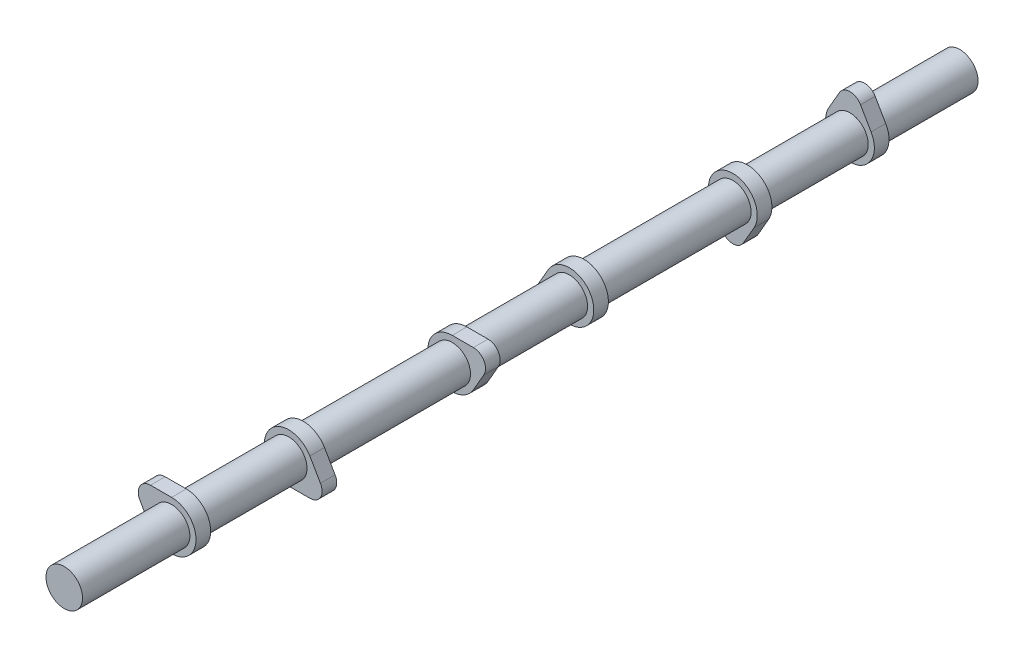
ISO-10303-21;
HEADER;
FILE_DESCRIPTION(('STEP AP214'),'2;1');
FILE_NAME('part.step','',(''),(''),'','','');
FILE_SCHEMA(('AUTOMOTIVE_DESIGN { 1 0 10303 214 1 1 1 1 }'));
ENDSEC;
DATA;
#1=APPLICATION_CONTEXT('core data for automotive mechanical design processes');
#2=APPLICATION_PROTOCOL_DEFINITION('international standard','automotive_design',2000,#1);
#3=PRODUCT_CONTEXT('',#1,'mechanical');
#4=PRODUCT('Part','Part','',(#3));
#5=PRODUCT_RELATED_PRODUCT_CATEGORY('part','',(#4));
#6=PRODUCT_DEFINITION_FORMATION('','',#4);
#7=PRODUCT_DEFINITION_CONTEXT('part definition',#1,'design');
#8=PRODUCT_DEFINITION('design','',#6,#7);
#9=PRODUCT_DEFINITION_SHAPE('','',#8);
#10=(LENGTH_UNIT() NAMED_UNIT(*) SI_UNIT(.MILLI.,.METRE.));
#11=(NAMED_UNIT(*) PLANE_ANGLE_UNIT() SI_UNIT($,.RADIAN.));
#12=(NAMED_UNIT(*) SI_UNIT($,.STERADIAN.) SOLID_ANGLE_UNIT());
#13=UNCERTAINTY_MEASURE_WITH_UNIT(LENGTH_MEASURE(1.E-05),#10,'distance_accuracy_value','');
#14=(GEOMETRIC_REPRESENTATION_CONTEXT(3) GLOBAL_UNCERTAINTY_ASSIGNED_CONTEXT((#13)) GLOBAL_UNIT_ASSIGNED_CONTEXT((#10,
#11,#12)) REPRESENTATION_CONTEXT('',''));
#15=CARTESIAN_POINT('',(0.,0.,0.));
#16=DIRECTION('',(0.,0.,1.));
#17=DIRECTION('',(1.,0.,0.));
#18=AXIS2_PLACEMENT_3D('',#15,#16,#17);
#19=CARTESIAN_POINT('',(0.,0.,412.75));
#20=DIRECTION('',(0.,0.,-1.));
#21=DIRECTION('',(-1.,0.,0.));
#22=AXIS2_PLACEMENT_3D('',#19,#20,#21);
#23=CYLINDRICAL_SURFACE('',#22,9.5);
#24=CARTESIAN_POINT('',(0.,0.,210.82));
#25=DIRECTION('',(0.,0.,1.));
#26=DIRECTION('',(1.,0.,0.));
#27=AXIS2_PLACEMENT_3D('',#24,#25,#26);
#28=CIRCLE('',#27,9.5);
#29=CARTESIAN_POINT('',(9.5,0.,210.82));
#30=VERTEX_POINT('',#29);
#31=EDGE_CURVE('E399',#30,#30,#28,.F.);
#32=ORIENTED_EDGE('',*,*,#31,.F.);
#33=EDGE_LOOP('',(#32));
#34=FACE_BOUND('',#33,.T.);
#35=CARTESIAN_POINT('',(0.,0.,288.29));
#36=DIRECTION('',(0.,0.,1.));
#37=DIRECTION('',(1.,0.,0.));
#38=AXIS2_PLACEMENT_3D('',#35,#36,#37);
#39=CIRCLE('',#38,9.5);
#40=CARTESIAN_POINT('',(9.5,0.,288.29));
#41=VERTEX_POINT('',#40);
#42=EDGE_CURVE('E230',#41,#41,#39,.F.);
#43=ORIENTED_EDGE('',*,*,#42,.T.);
#44=EDGE_LOOP('',(#43));
#45=FACE_BOUND('',#44,.T.);
#46=ADVANCED_FACE('F33',(#34,#45),#23,.T.);
#47=CARTESIAN_POINT('',(0.,0.,64.77));
#48=DIRECTION('',(0.,0.,1.));
#49=DIRECTION('',(1.,0.,0.));
#50=AXIS2_PLACEMENT_3D('',#47,#48,#49);
#51=CIRCLE('',#50,9.5);
#52=CARTESIAN_POINT('',(9.5,0.,64.77));
#53=VERTEX_POINT('',#52);
#54=EDGE_CURVE('E371',#53,#53,#51,.F.);
#55=ORIENTED_EDGE('',*,*,#54,.F.);
#56=EDGE_LOOP('',(#55));
#57=FACE_BOUND('',#56,.T.);
#58=CARTESIAN_POINT('',(0.,0.,142.24));
#59=DIRECTION('',(0.,0.,1.));
#60=DIRECTION('',(1.,0.,0.));
#61=AXIS2_PLACEMENT_3D('',#58,#59,#60);
#62=CIRCLE('',#61,9.5);
#63=CARTESIAN_POINT('',(9.5,0.,142.24));
#64=VERTEX_POINT('',#63);
#65=EDGE_CURVE('E298',#64,#64,#62,.F.);
#66=ORIENTED_EDGE('',*,*,#65,.T.);
#67=EDGE_LOOP('',(#66));
#68=FACE_BOUND('',#67,.T.);
#69=ADVANCED_FACE('F436',(#57,#68),#23,.T.);
#70=CARTESIAN_POINT('',(0.,0.,3.80999999999998));
#71=DIRECTION('',(0.,0.,1.));
#72=DIRECTION('',(1.,0.,0.));
#73=AXIS2_PLACEMENT_3D('',#70,#71,#72);
#74=CIRCLE('',#73,9.5);
#75=CARTESIAN_POINT('',(9.5,0.,3.80999999999998));
#76=VERTEX_POINT('',#75);
#77=EDGE_CURVE('E368',#76,#76,#74,.T.);
#78=ORIENTED_EDGE('',*,*,#77,.T.);
#79=EDGE_LOOP('',(#78));
#80=FACE_BOUND('',#79,.T.);
#81=CARTESIAN_POINT('',(0.,0.,57.15));
#82=DIRECTION('',(0.,0.,1.));
#83=DIRECTION('',(1.,0.,0.));
#84=AXIS2_PLACEMENT_3D('',#81,#82,#83);
#85=CIRCLE('',#84,9.5);
#86=CARTESIAN_POINT('',(9.5,0.,57.15));
#87=VERTEX_POINT('',#86);
#88=EDGE_CURVE('E360',#87,#87,#85,.F.);
#89=ORIENTED_EDGE('',*,*,#88,.T.);
#90=EDGE_LOOP('',(#89));
#91=FACE_BOUND('',#90,.T.);
#92=ADVANCED_FACE('F442',(#80,#91),#23,.T.);
#93=CARTESIAN_POINT('',(0.,12.7,3.81));
#94=DIRECTION('',(0.,0.,-1.));
#95=DIRECTION('',(-1.,0.,0.));
#96=AXIS2_PLACEMENT_3D('',#93,#94,#95);
#97=CYLINDRICAL_SURFACE('',#96,6.35);
#98=CARTESIAN_POINT('',(0.,12.7,-3.81));
#99=DIRECTION('',(0.,0.,1.));
#100=DIRECTION('',(1.,0.,0.));
#101=AXIS2_PLACEMENT_3D('',#98,#99,#100);
#102=CIRCLE('',#101,6.35);
#103=CARTESIAN_POINT('',(5.49926131403119,15.875,-3.81));
#104=VERTEX_POINT('',#103);
#105=CARTESIAN_POINT('',(-5.49926131403118,15.875,-3.81));
#106=VERTEX_POINT('',#105);
#107=EDGE_CURVE('E380',#104,#106,#102,.T.);
#108=ORIENTED_EDGE('',*,*,#107,.T.);
#109=DIRECTION('',(0.,0.,-1.));
#110=VECTOR('',#109,1.);
#111=CARTESIAN_POINT('',(-5.49926131403118,15.875,3.81));
#112=LINE('',#111,#110);
#113=CARTESIAN_POINT('',(-5.49926131403118,15.875,3.81));
#114=VERTEX_POINT('',#113);
#115=EDGE_CURVE('E372',#114,#106,#112,.T.);
#116=ORIENTED_EDGE('',*,*,#115,.F.);
#117=CARTESIAN_POINT('',(0.,12.7,3.81));
#118=DIRECTION('',(0.,0.,1.));
#119=DIRECTION('',(1.,0.,0.));
#120=AXIS2_PLACEMENT_3D('',#117,#118,#119);
#121=CIRCLE('',#120,6.35);
#122=CARTESIAN_POINT('',(5.49926131403119,15.875,3.81));
#123=VERTEX_POINT('',#122);
#124=EDGE_CURVE('E373',#123,#114,#121,.T.);
#125=ORIENTED_EDGE('',*,*,#124,.F.);
#126=DIRECTION('',(0.,0.,-1.));
#127=VECTOR('',#126,1.);
#128=CARTESIAN_POINT('',(5.49926131403119,15.875,3.81));
#129=LINE('',#128,#127);
#130=EDGE_CURVE('E379',#123,#104,#129,.T.);
#131=ORIENTED_EDGE('',*,*,#130,.T.);
#132=EDGE_LOOP('',(#108,#116,#125,#131));
#133=FACE_BOUND('',#132,.T.);
#134=ADVANCED_FACE('F35',(#133),#97,.T.);
#135=CARTESIAN_POINT('',(-5.49926131403118,15.875,3.81));
#136=DIRECTION('',(0.866025403784439,-0.5,0.));
#137=DIRECTION('',(0.5,0.866025403784439,0.));
#138=AXIS2_PLACEMENT_3D('',#135,#136,#137);
#139=PLANE('',#138);
#140=DIRECTION('',(-0.5,-0.866025403784439,0.));
#141=VECTOR('',#140,1.);
#142=CARTESIAN_POINT('',(-5.49926131403118,15.875,-3.81));
#143=LINE('',#142,#141);
#144=CARTESIAN_POINT('',(-10.9985226280624,6.35,-3.81));
#145=VERTEX_POINT('',#144);
#146=EDGE_CURVE('E383',#106,#145,#143,.T.);
#147=ORIENTED_EDGE('',*,*,#146,.T.);
#148=DIRECTION('',(0.,0.,-1.));
#149=VECTOR('',#148,1.);
#150=CARTESIAN_POINT('',(-10.9985226280624,6.35,3.81));
#151=LINE('',#150,#149);
#152=CARTESIAN_POINT('',(-10.9985226280624,6.35,3.81));
#153=VERTEX_POINT('',#152);
#154=EDGE_CURVE('E390',#153,#145,#151,.T.);
#155=ORIENTED_EDGE('',*,*,#154,.F.);
#156=DIRECTION('',(-0.5,-0.866025403784439,0.));
#157=VECTOR('',#156,1.);
#158=CARTESIAN_POINT('',(-5.49926131403118,15.875,3.81));
#159=LINE('',#158,#157);
#160=EDGE_CURVE('E82',#114,#153,#159,.T.);
#161=ORIENTED_EDGE('',*,*,#160,.F.);
#162=ORIENTED_EDGE('',*,*,#115,.T.);
#163=EDGE_LOOP('',(#147,#155,#161,#162));
#164=FACE_BOUND('',#163,.T.);
#165=ADVANCED_FACE('F592',(#164),#139,.F.);
#166=CARTESIAN_POINT('',(0.,0.,3.81));
#167=DIRECTION('',(0.,0.,-1.));
#168=DIRECTION('',(-1.,0.,0.));
#169=AXIS2_PLACEMENT_3D('',#166,#167,#168);
#170=CYLINDRICAL_SURFACE('',#169,12.7);
#171=CARTESIAN_POINT('',(0.,0.,-3.81));
#172=DIRECTION('',(0.,0.,1.));
#173=DIRECTION('',(1.,0.,0.));
#174=AXIS2_PLACEMENT_3D('',#171,#172,#173);
#175=CIRCLE('',#174,12.7);
#176=CARTESIAN_POINT('',(10.9985226280624,6.35,-3.81));
#177=VERTEX_POINT('',#176);
#178=EDGE_CURVE('E68',#145,#177,#175,.T.);
#179=ORIENTED_EDGE('',*,*,#178,.T.);
#180=DIRECTION('',(0.,0.,-1.));
#181=VECTOR('',#180,1.);
#182=CARTESIAN_POINT('',(10.9985226280624,6.35,3.81));
#183=LINE('',#182,#181);
#184=CARTESIAN_POINT('',(10.9985226280624,6.35,3.81));
#185=VERTEX_POINT('',#184);
#186=EDGE_CURVE('E388',#185,#177,#183,.T.);
#187=ORIENTED_EDGE('',*,*,#186,.F.);
#188=CARTESIAN_POINT('',(0.,0.,3.81));
#189=DIRECTION('',(0.,0.,1.));
#190=DIRECTION('',(1.,0.,0.));
#191=AXIS2_PLACEMENT_3D('',#188,#189,#190);
#192=CIRCLE('',#191,12.7);
#193=EDGE_CURVE('E376',#153,#185,#192,.T.);
#194=ORIENTED_EDGE('',*,*,#193,.F.);
#195=ORIENTED_EDGE('',*,*,#154,.T.);
#196=EDGE_LOOP('',(#179,#187,#194,#195));
#197=FACE_BOUND('',#196,.T.);
#198=ADVANCED_FACE('F881',(#197),#170,.T.);
#199=CARTESIAN_POINT('',(5.49926131403119,15.875,3.81));
#200=DIRECTION('',(-0.866025403784439,-0.5,0.));
#201=DIRECTION('',(0.5,-0.866025403784439,0.));
#202=AXIS2_PLACEMENT_3D('',#199,#200,#201);
#203=PLANE('',#202);
#204=DIRECTION('',(-0.5,0.866025403784439,0.));
#205=VECTOR('',#204,1.);
#206=CARTESIAN_POINT('',(5.49926131403119,15.875,-3.81));
#207=LINE('',#206,#205);
#208=EDGE_CURVE('E74',#177,#104,#207,.T.);
#209=ORIENTED_EDGE('',*,*,#208,.T.);
#210=ORIENTED_EDGE('',*,*,#130,.F.);
#211=DIRECTION('',(-0.5,0.866025403784439,0.));
#212=VECTOR('',#211,1.);
#213=CARTESIAN_POINT('',(5.49926131403119,15.875,3.81));
#214=LINE('',#213,#212);
#215=EDGE_CURVE('E50',#185,#123,#214,.T.);
#216=ORIENTED_EDGE('',*,*,#215,.F.);
#217=ORIENTED_EDGE('',*,*,#186,.T.);
#218=EDGE_LOOP('',(#209,#210,#216,#217));
#219=FACE_BOUND('',#218,.T.);
#220=ADVANCED_FACE('F859',(#219),#203,.F.);
#221=CARTESIAN_POINT('',(0.,12.7,3.81));
#222=DIRECTION('',(0.,0.,1.));
#223=DIRECTION('',(1.,0.,0.));
#224=AXIS2_PLACEMENT_3D('',#221,#222,#223);
#225=PLANE('',#224);
#226=ORIENTED_EDGE('',*,*,#77,.F.);
#227=EDGE_LOOP('',(#226));
#228=FACE_BOUND('',#227,.T.);
#229=ORIENTED_EDGE('',*,*,#124,.T.);
#230=ORIENTED_EDGE('',*,*,#160,.T.);
#231=ORIENTED_EDGE('',*,*,#193,.T.);
#232=ORIENTED_EDGE('',*,*,#215,.T.);
#233=EDGE_LOOP('',(#229,#230,#231,#232));
#234=FACE_BOUND('',#233,.T.);
#235=ADVANCED_FACE('F850',(#228,#234),#225,.T.);
#236=CARTESIAN_POINT('',(0.,12.7,-3.81));
#237=DIRECTION('',(0.,0.,1.));
#238=DIRECTION('',(1.,0.,0.));
#239=AXIS2_PLACEMENT_3D('',#236,#237,#238);
#240=PLANE('',#239);
#241=CARTESIAN_POINT('',(0.,0.,-3.80999999999998));
#242=DIRECTION('',(0.,0.,1.));
#243=DIRECTION('',(1.,0.,0.));
#244=AXIS2_PLACEMENT_3D('',#241,#242,#243);
#245=CIRCLE('',#244,9.5);
#246=CARTESIAN_POINT('',(9.5,0.,-3.80999999999998));
#247=VERTEX_POINT('',#246);
#248=EDGE_CURVE('E364',#247,#247,#245,.T.);
#249=ORIENTED_EDGE('',*,*,#248,.T.);
#250=EDGE_LOOP('',(#249));
#251=FACE_BOUND('',#250,.T.);
#252=ORIENTED_EDGE('',*,*,#107,.F.);
#253=ORIENTED_EDGE('',*,*,#208,.F.);
#254=ORIENTED_EDGE('',*,*,#178,.F.);
#255=ORIENTED_EDGE('',*,*,#146,.F.);
#256=EDGE_LOOP('',(#252,#253,#254,#255));
#257=FACE_BOUND('',#256,.T.);
#258=ADVANCED_FACE('F583',(#251,#257),#240,.F.);
#259=CARTESIAN_POINT('',(0.,0.,-53.34));
#260=DIRECTION('',(0.,0.,-1.));
#261=DIRECTION('',(-1.,0.,0.));
#262=AXIS2_PLACEMENT_3D('',#259,#260,#261);
#263=PLANE('',#262);
#264=CARTESIAN_POINT('',(0.,0.,-53.34));
#265=DIRECTION('',(0.,0.,-1.));
#266=DIRECTION('',(-1.,0.,0.));
#267=AXIS2_PLACEMENT_3D('',#264,#265,#266);
#268=CIRCLE('',#267,9.5);
#269=CARTESIAN_POINT('',(-9.5,0.,-53.34));
#270=VERTEX_POINT('',#269);
#271=EDGE_CURVE('E365',#270,#270,#268,.T.);
#272=ORIENTED_EDGE('',*,*,#271,.T.);
#273=EDGE_LOOP('',(#272));
#274=FACE_BOUND('',#273,.T.);
#275=ADVANCED_FACE('F566',(#274),#263,.T.);
#276=ORIENTED_EDGE('',*,*,#271,.F.);
#277=EDGE_LOOP('',(#276));
#278=FACE_BOUND('',#277,.T.);
#279=ORIENTED_EDGE('',*,*,#248,.F.);
#280=EDGE_LOOP('',(#279));
#281=FACE_BOUND('',#280,.T.);
#282=ADVANCED_FACE('F422',(#278,#281),#23,.T.);
#283=CARTESIAN_POINT('',(0.,-12.7,64.77));
#284=DIRECTION('',(0.,0.,-1.));
#285=DIRECTION('',(1.,0.,0.));
#286=AXIS2_PLACEMENT_3D('',#283,#284,#285);
#287=CYLINDRICAL_SURFACE('',#286,6.35);
#288=CARTESIAN_POINT('',(0.,-12.7,57.15));
#289=DIRECTION('',(0.,0.,1.));
#290=DIRECTION('',(-1.,0.,0.));
#291=AXIS2_PLACEMENT_3D('',#288,#289,#290);
#292=CIRCLE('',#291,6.35);
#293=CARTESIAN_POINT('',(-5.4992613140313,-15.875,57.15));
#294=VERTEX_POINT('',#293);
#295=CARTESIAN_POINT('',(5.49926131403107,-15.875,57.15));
#296=VERTEX_POINT('',#295);
#297=EDGE_CURVE('E341',#294,#296,#292,.T.);
#298=ORIENTED_EDGE('',*,*,#297,.T.);
#299=DIRECTION('',(0.,0.,-1.));
#300=VECTOR('',#299,1.);
#301=CARTESIAN_POINT('',(5.49926131403107,-15.875,64.77));
#302=LINE('',#301,#300);
#303=CARTESIAN_POINT('',(5.49926131403107,-15.875,64.77));
#304=VERTEX_POINT('',#303);
#305=EDGE_CURVE('E357',#304,#296,#302,.T.);
#306=ORIENTED_EDGE('',*,*,#305,.F.);
#307=CARTESIAN_POINT('',(0.,-12.7,64.77));
#308=DIRECTION('',(0.,0.,1.));
#309=DIRECTION('',(-1.,0.,0.));
#310=AXIS2_PLACEMENT_3D('',#307,#308,#309);
#311=CIRCLE('',#310,6.35);
#312=CARTESIAN_POINT('',(-5.4992613140313,-15.875,64.77));
#313=VERTEX_POINT('',#312);
#314=EDGE_CURVE('E330',#313,#304,#311,.T.);
#315=ORIENTED_EDGE('',*,*,#314,.F.);
#316=DIRECTION('',(0.,0.,-1.));
#317=VECTOR('',#316,1.);
#318=CARTESIAN_POINT('',(-5.4992613140313,-15.875,64.77));
#319=LINE('',#318,#317);
#320=EDGE_CURVE('E340',#313,#294,#319,.T.);
#321=ORIENTED_EDGE('',*,*,#320,.T.);
#322=EDGE_LOOP('',(#298,#306,#315,#321));
#323=FACE_BOUND('',#322,.T.);
#324=ADVANCED_FACE('F559',(#323),#287,.T.);
#325=CARTESIAN_POINT('',(5.49926131403107,-15.875,64.77));
#326=DIRECTION('',(-0.866025403784435,0.500000000000006,0.));
#327=DIRECTION('',(-0.500000000000006,-0.866025403784435,0.));
#328=AXIS2_PLACEMENT_3D('',#325,#326,#327);
#329=PLANE('',#328);
#330=DIRECTION('',(0.500000000000006,0.866025403784435,0.));
#331=VECTOR('',#330,1.);
#332=CARTESIAN_POINT('',(5.49926131403107,-15.875,57.15));
#333=LINE('',#332,#331);
#334=CARTESIAN_POINT('',(10.9985226280623,-6.35000000000008,57.15));
#335=VERTEX_POINT('',#334);
#336=EDGE_CURVE('E344',#296,#335,#333,.T.);
#337=ORIENTED_EDGE('',*,*,#336,.T.);
#338=DIRECTION('',(0.,0.,-1.));
#339=VECTOR('',#338,1.);
#340=CARTESIAN_POINT('',(10.9985226280623,-6.35000000000008,64.77));
#341=LINE('',#340,#339);
#342=CARTESIAN_POINT('',(10.9985226280623,-6.35000000000008,64.77));
#343=VERTEX_POINT('',#342);
#344=EDGE_CURVE('E354',#343,#335,#341,.T.);
#345=ORIENTED_EDGE('',*,*,#344,.F.);
#346=DIRECTION('',(0.500000000000006,0.866025403784435,0.));
#347=VECTOR('',#346,1.);
#348=CARTESIAN_POINT('',(5.49926131403107,-15.875,64.77));
#349=LINE('',#348,#347);
#350=EDGE_CURVE('E333',#304,#343,#349,.T.);
#351=ORIENTED_EDGE('',*,*,#350,.F.);
#352=ORIENTED_EDGE('',*,*,#305,.T.);
#353=EDGE_LOOP('',(#337,#345,#351,#352));
#354=FACE_BOUND('',#353,.T.);
#355=ADVANCED_FACE('F556',(#354),#329,.F.);
#356=CARTESIAN_POINT('',(0.,0.,64.77));
#357=DIRECTION('',(0.,0.,-1.));
#358=DIRECTION('',(1.,0.,0.));
#359=AXIS2_PLACEMENT_3D('',#356,#357,#358);
#360=CYLINDRICAL_SURFACE('',#359,12.7);
#361=CARTESIAN_POINT('',(0.,0.,57.15));
#362=DIRECTION('',(0.,0.,1.));
#363=DIRECTION('',(-1.,0.,0.));
#364=AXIS2_PLACEMENT_3D('',#361,#362,#363);
#365=CIRCLE('',#364,12.7);
#366=CARTESIAN_POINT('',(-10.9985226280624,-6.34999999999993,57.15));
#367=VERTEX_POINT('',#366);
#368=EDGE_CURVE('E346',#335,#367,#365,.T.);
#369=ORIENTED_EDGE('',*,*,#368,.T.);
#370=DIRECTION('',(0.,0.,-1.));
#371=VECTOR('',#370,1.);
#372=CARTESIAN_POINT('',(-10.9985226280624,-6.34999999999993,64.77));
#373=LINE('',#372,#371);
#374=CARTESIAN_POINT('',(-10.9985226280624,-6.34999999999993,64.77));
#375=VERTEX_POINT('',#374);
#376=EDGE_CURVE('E351',#375,#367,#373,.T.);
#377=ORIENTED_EDGE('',*,*,#376,.F.);
#378=CARTESIAN_POINT('',(0.,0.,64.77));
#379=DIRECTION('',(0.,0.,1.));
#380=DIRECTION('',(-1.,0.,0.));
#381=AXIS2_PLACEMENT_3D('',#378,#379,#380);
#382=CIRCLE('',#381,12.7);
#383=EDGE_CURVE('E336',#343,#375,#382,.T.);
#384=ORIENTED_EDGE('',*,*,#383,.F.);
#385=ORIENTED_EDGE('',*,*,#344,.T.);
#386=EDGE_LOOP('',(#369,#377,#384,#385));
#387=FACE_BOUND('',#386,.T.);
#388=ADVANCED_FACE('F552',(#387),#360,.T.);
#389=CARTESIAN_POINT('',(-5.4992613140313,-15.875,64.77));
#390=DIRECTION('',(0.866025403784442,0.499999999999994,0.));
#391=DIRECTION('',(-0.499999999999994,0.866025403784442,0.));
#392=AXIS2_PLACEMENT_3D('',#389,#390,#391);
#393=PLANE('',#392);
#394=DIRECTION('',(0.499999999999994,-0.866025403784442,0.));
#395=VECTOR('',#394,1.);
#396=CARTESIAN_POINT('',(-5.4992613140313,-15.875,57.15));
#397=LINE('',#396,#395);
#398=EDGE_CURVE('E334',#367,#294,#397,.T.);
#399=ORIENTED_EDGE('',*,*,#398,.T.);
#400=ORIENTED_EDGE('',*,*,#320,.F.);
#401=DIRECTION('',(0.499999999999994,-0.866025403784442,0.));
#402=VECTOR('',#401,1.);
#403=CARTESIAN_POINT('',(-5.4992613140313,-15.875,64.77));
#404=LINE('',#403,#402);
#405=EDGE_CURVE('E338',#375,#313,#404,.T.);
#406=ORIENTED_EDGE('',*,*,#405,.F.);
#407=ORIENTED_EDGE('',*,*,#376,.T.);
#408=EDGE_LOOP('',(#399,#400,#406,#407));
#409=FACE_BOUND('',#408,.T.);
#410=ADVANCED_FACE('F545',(#409),#393,.F.);
#411=CARTESIAN_POINT('',(0.,-12.7,64.77));
#412=DIRECTION('',(0.,0.,1.));
#413=DIRECTION('',(-1.,0.,0.));
#414=AXIS2_PLACEMENT_3D('',#411,#412,#413);
#415=PLANE('',#414);
#416=ORIENTED_EDGE('',*,*,#54,.T.);
#417=EDGE_LOOP('',(#416));
#418=FACE_BOUND('',#417,.T.);
#419=ORIENTED_EDGE('',*,*,#314,.T.);
#420=ORIENTED_EDGE('',*,*,#350,.T.);
#421=ORIENTED_EDGE('',*,*,#383,.T.);
#422=ORIENTED_EDGE('',*,*,#405,.T.);
#423=EDGE_LOOP('',(#419,#420,#421,#422));
#424=FACE_BOUND('',#423,.T.);
#425=ADVANCED_FACE('F542',(#418,#424),#415,.T.);
#426=CARTESIAN_POINT('',(0.,-12.7,57.15));
#427=DIRECTION('',(0.,0.,1.));
#428=DIRECTION('',(-1.,0.,0.));
#429=AXIS2_PLACEMENT_3D('',#426,#427,#428);
#430=PLANE('',#429);
#431=ORIENTED_EDGE('',*,*,#88,.F.);
#432=EDGE_LOOP('',(#431));
#433=FACE_BOUND('',#432,.T.);
#434=ORIENTED_EDGE('',*,*,#297,.F.);
#435=ORIENTED_EDGE('',*,*,#398,.F.);
#436=ORIENTED_EDGE('',*,*,#368,.F.);
#437=ORIENTED_EDGE('',*,*,#336,.F.);
#438=EDGE_LOOP('',(#434,#435,#436,#437));
#439=FACE_BOUND('',#438,.T.);
#440=ADVANCED_FACE('F517',(#433,#439),#430,.F.);
#441=CARTESIAN_POINT('',(-10.9985226280623,-6.35000000000005,149.86));
#442=DIRECTION('',(0.,0.,-1.));
#443=DIRECTION('',(0.500000000000004,-0.866025403784436,0.));
#444=AXIS2_PLACEMENT_3D('',#441,#442,#443);
#445=CYLINDRICAL_SURFACE('',#444,6.35);
#446=CARTESIAN_POINT('',(-10.9985226280623,-6.35000000000005,142.24));
#447=DIRECTION('',(0.,0.,1.));
#448=DIRECTION('',(-0.500000000000004,0.866025403784436,0.));
#449=AXIS2_PLACEMENT_3D('',#446,#447,#448);
#450=CIRCLE('',#449,6.35);
#451=CARTESIAN_POINT('',(-16.4977839420935,-3.17500000000008,142.24));
#452=VERTEX_POINT('',#451);
#453=CARTESIAN_POINT('',(-10.9985226280623,-12.7000000000001,142.24));
#454=VERTEX_POINT('',#453);
#455=EDGE_CURVE('E279',#452,#454,#450,.T.);
#456=ORIENTED_EDGE('',*,*,#455,.T.);
#457=DIRECTION('',(0.,0.,-1.));
#458=VECTOR('',#457,1.);
#459=CARTESIAN_POINT('',(-10.9985226280623,-12.7000000000001,149.86));
#460=LINE('',#459,#458);
#461=CARTESIAN_POINT('',(-10.9985226280623,-12.7000000000001,149.86));
#462=VERTEX_POINT('',#461);
#463=EDGE_CURVE('E295',#462,#454,#460,.T.);
#464=ORIENTED_EDGE('',*,*,#463,.F.);
#465=CARTESIAN_POINT('',(-10.9985226280623,-6.35000000000005,149.86));
#466=DIRECTION('',(0.,0.,1.));
#467=DIRECTION('',(-0.500000000000004,0.866025403784436,0.));
#468=AXIS2_PLACEMENT_3D('',#465,#466,#467);
#469=CIRCLE('',#468,6.35);
#470=CARTESIAN_POINT('',(-16.4977839420935,-3.17500000000008,149.86));
#471=VERTEX_POINT('',#470);
#472=EDGE_CURVE('E268',#471,#462,#469,.T.);
#473=ORIENTED_EDGE('',*,*,#472,.F.);
#474=DIRECTION('',(0.,0.,-1.));
#475=VECTOR('',#474,1.);
#476=CARTESIAN_POINT('',(-16.4977839420935,-3.17500000000008,149.86));
#477=LINE('',#476,#475);
#478=EDGE_CURVE('E278',#471,#452,#477,.T.);
#479=ORIENTED_EDGE('',*,*,#478,.T.);
#480=EDGE_LOOP('',(#456,#464,#473,#479));
#481=FACE_BOUND('',#480,.T.);
#482=ADVANCED_FACE('F513',(#481),#445,.T.);
#483=CARTESIAN_POINT('',(-10.9985226280623,-12.7000000000001,149.86));
#484=DIRECTION('',(0.,1.,0.));
#485=DIRECTION('',(-1.,0.,0.));
#486=AXIS2_PLACEMENT_3D('',#483,#484,#485);
#487=PLANE('',#486);
#488=DIRECTION('',(1.,0.,0.));
#489=VECTOR('',#488,1.);
#490=CARTESIAN_POINT('',(-10.9985226280623,-12.7000000000001,142.24));
#491=LINE('',#490,#489);
#492=CARTESIAN_POINT('',(0.,-12.7,142.24));
#493=VERTEX_POINT('',#492);
#494=EDGE_CURVE('E282',#454,#493,#491,.T.);
#495=ORIENTED_EDGE('',*,*,#494,.T.);
#496=DIRECTION('',(0.,0.,-1.));
#497=VECTOR('',#496,1.);
#498=CARTESIAN_POINT('',(0.,-12.7,149.86));
#499=LINE('',#498,#497);
#500=CARTESIAN_POINT('',(0.,-12.7,149.86));
#501=VERTEX_POINT('',#500);
#502=EDGE_CURVE('E292',#501,#493,#499,.T.);
#503=ORIENTED_EDGE('',*,*,#502,.F.);
#504=DIRECTION('',(1.,0.,0.));
#505=VECTOR('',#504,1.);
#506=CARTESIAN_POINT('',(-10.9985226280623,-12.7000000000001,149.86));
#507=LINE('',#506,#505);
#508=EDGE_CURVE('E271',#462,#501,#507,.T.);
#509=ORIENTED_EDGE('',*,*,#508,.F.);
#510=ORIENTED_EDGE('',*,*,#463,.T.);
#511=EDGE_LOOP('',(#495,#503,#509,#510));
#512=FACE_BOUND('',#511,.T.);
#513=ADVANCED_FACE('F509',(#512),#487,.F.);
#514=CARTESIAN_POINT('',(0.,0.,149.86));
#515=DIRECTION('',(0.,0.,-1.));
#516=DIRECTION('',(0.500000000000004,-0.866025403784436,0.));
#517=AXIS2_PLACEMENT_3D('',#514,#515,#516);
#518=CYLINDRICAL_SURFACE('',#517,12.7);
#519=CARTESIAN_POINT('',(0.,0.,142.24));
#520=DIRECTION('',(0.,0.,1.));
#521=DIRECTION('',(-0.500000000000004,0.866025403784436,0.));
#522=AXIS2_PLACEMENT_3D('',#519,#520,#521);
#523=CIRCLE('',#522,12.7);
#524=CARTESIAN_POINT('',(-10.9985226280624,6.34999999999995,142.24));
#525=VERTEX_POINT('',#524);
#526=EDGE_CURVE('E284',#493,#525,#523,.T.);
#527=ORIENTED_EDGE('',*,*,#526,.T.);
#528=DIRECTION('',(0.,0.,-1.));
#529=VECTOR('',#528,1.);
#530=CARTESIAN_POINT('',(-10.9985226280624,6.34999999999995,149.86));
#531=LINE('',#530,#529);
#532=CARTESIAN_POINT('',(-10.9985226280624,6.34999999999995,149.86));
#533=VERTEX_POINT('',#532);
#534=EDGE_CURVE('E289',#533,#525,#531,.T.);
#535=ORIENTED_EDGE('',*,*,#534,.F.);
#536=CARTESIAN_POINT('',(0.,0.,149.86));
#537=DIRECTION('',(0.,0.,1.));
#538=DIRECTION('',(-0.500000000000004,0.866025403784436,0.));
#539=AXIS2_PLACEMENT_3D('',#536,#537,#538);
#540=CIRCLE('',#539,12.7);
#541=EDGE_CURVE('E274',#501,#533,#540,.T.);
#542=ORIENTED_EDGE('',*,*,#541,.F.);
#543=ORIENTED_EDGE('',*,*,#502,.T.);
#544=EDGE_LOOP('',(#527,#535,#542,#543));
#545=FACE_BOUND('',#544,.T.);
#546=ADVANCED_FACE('F505',(#545),#518,.T.);
#547=CARTESIAN_POINT('',(-16.4977839420935,-3.17500000000008,149.86));
#548=DIRECTION('',(0.866025403784441,-0.499999999999996,0.));
#549=DIRECTION('',(0.499999999999996,0.866025403784441,0.));
#550=AXIS2_PLACEMENT_3D('',#547,#548,#549);
#551=PLANE('',#550);
#552=DIRECTION('',(-0.499999999999996,-0.866025403784441,0.));
#553=VECTOR('',#552,1.);
#554=CARTESIAN_POINT('',(-16.4977839420935,-3.17500000000008,142.24));
#555=LINE('',#554,#553);
#556=EDGE_CURVE('E272',#525,#452,#555,.T.);
#557=ORIENTED_EDGE('',*,*,#556,.T.);
#558=ORIENTED_EDGE('',*,*,#478,.F.);
#559=DIRECTION('',(-0.499999999999996,-0.866025403784441,0.));
#560=VECTOR('',#559,1.);
#561=CARTESIAN_POINT('',(-16.4977839420935,-3.17500000000008,149.86));
#562=LINE('',#561,#560);
#563=EDGE_CURVE('E276',#533,#471,#562,.T.);
#564=ORIENTED_EDGE('',*,*,#563,.F.);
#565=ORIENTED_EDGE('',*,*,#534,.T.);
#566=EDGE_LOOP('',(#557,#558,#564,#565));
#567=FACE_BOUND('',#566,.T.);
#568=ADVANCED_FACE('F497',(#567),#551,.F.);
#569=CARTESIAN_POINT('',(-10.9985226280623,-6.35000000000005,149.86));
#570=DIRECTION('',(0.,0.,1.));
#571=DIRECTION('',(-0.500000000000004,0.866025403784436,0.));
#572=AXIS2_PLACEMENT_3D('',#569,#570,#571);
#573=PLANE('',#572);
#574=CARTESIAN_POINT('',(0.,0.,149.86));
#575=DIRECTION('',(0.,0.,1.));
#576=DIRECTION('',(1.,0.,0.));
#577=AXIS2_PLACEMENT_3D('',#574,#575,#576);
#578=CIRCLE('',#577,9.5);
#579=CARTESIAN_POINT('',(9.5,0.,149.86));
#580=VERTEX_POINT('',#579);
#581=EDGE_CURVE('E404',#580,#580,#578,.F.);
#582=ORIENTED_EDGE('',*,*,#581,.T.);
#583=EDGE_LOOP('',(#582));
#584=FACE_BOUND('',#583,.T.);
#585=ORIENTED_EDGE('',*,*,#472,.T.);
#586=ORIENTED_EDGE('',*,*,#508,.T.);
#587=ORIENTED_EDGE('',*,*,#541,.T.);
#588=ORIENTED_EDGE('',*,*,#563,.T.);
#589=EDGE_LOOP('',(#585,#586,#587,#588));
#590=FACE_BOUND('',#589,.T.);
#591=ADVANCED_FACE('F493',(#584,#590),#573,.T.);
#592=CARTESIAN_POINT('',(-10.9985226280623,-6.35000000000005,142.24));
#593=DIRECTION('',(0.,0.,1.));
#594=DIRECTION('',(-0.500000000000004,0.866025403784436,0.));
#595=AXIS2_PLACEMENT_3D('',#592,#593,#594);
#596=PLANE('',#595);
#597=ORIENTED_EDGE('',*,*,#65,.F.);
#598=EDGE_LOOP('',(#597));
#599=FACE_BOUND('',#598,.T.);
#600=ORIENTED_EDGE('',*,*,#455,.F.);
#601=ORIENTED_EDGE('',*,*,#556,.F.);
#602=ORIENTED_EDGE('',*,*,#526,.F.);
#603=ORIENTED_EDGE('',*,*,#494,.F.);
#604=EDGE_LOOP('',(#600,#601,#602,#603));
#605=FACE_BOUND('',#604,.T.);
#606=ADVANCED_FACE('F496',(#599,#605),#596,.F.);
#607=CARTESIAN_POINT('',(10.9985226280624,6.34999999999997,210.82));
#608=DIRECTION('',(0.,0.,1.));
#609=DIRECTION('',(0.499999999999998,-0.86602540378444,0.));
#610=AXIS2_PLACEMENT_3D('',#607,#608,#609);
#611=PLANE('',#610);
#612=ORIENTED_EDGE('',*,*,#31,.T.);
#613=EDGE_LOOP('',(#612));
#614=FACE_BOUND('',#613,.T.);
#615=CARTESIAN_POINT('',(10.9985226280624,6.34999999999997,210.82));
#616=DIRECTION('',(0.,0.,1.));
#617=DIRECTION('',(0.499999999999998,-0.86602540378444,0.));
#618=AXIS2_PLACEMENT_3D('',#615,#616,#617);
#619=CIRCLE('',#618,6.35);
#620=CARTESIAN_POINT('',(16.4977839420936,3.17499999999996,210.82));
#621=VERTEX_POINT('',#620);
#622=CARTESIAN_POINT('',(10.9985226280624,12.7,210.82));
#623=VERTEX_POINT('',#622);
#624=EDGE_CURVE('E299',#621,#623,#619,.T.);
#625=ORIENTED_EDGE('',*,*,#624,.T.);
#626=DIRECTION('',(-1.,0.,0.));
#627=VECTOR('',#626,1.);
#628=CARTESIAN_POINT('',(10.9985226280624,12.7,210.82));
#629=LINE('',#628,#627);
#630=CARTESIAN_POINT('',(0.,12.7,210.82));
#631=VERTEX_POINT('',#630);
#632=EDGE_CURVE('E302',#623,#631,#629,.T.);
#633=ORIENTED_EDGE('',*,*,#632,.T.);
#634=CARTESIAN_POINT('',(0.,0.,210.82));
#635=DIRECTION('',(0.,0.,1.));
#636=DIRECTION('',(0.499999999999998,-0.86602540378444,0.));
#637=AXIS2_PLACEMENT_3D('',#634,#635,#636);
#638=CIRCLE('',#637,12.7);
#639=CARTESIAN_POINT('',(10.9985226280624,-6.35000000000002,210.82));
#640=VERTEX_POINT('',#639);
#641=EDGE_CURVE('E305',#631,#640,#638,.T.);
#642=ORIENTED_EDGE('',*,*,#641,.T.);
#643=DIRECTION('',(0.500000000000002,0.866025403784438,0.));
#644=VECTOR('',#643,1.);
#645=CARTESIAN_POINT('',(16.4977839420936,3.17499999999996,210.82));
#646=LINE('',#645,#644);
#647=EDGE_CURVE('E307',#640,#621,#646,.T.);
#648=ORIENTED_EDGE('',*,*,#647,.T.);
#649=EDGE_LOOP('',(#625,#633,#642,#648));
#650=FACE_BOUND('',#649,.T.);
#651=ADVANCED_FACE('F501',(#614,#650),#611,.T.);
#652=CARTESIAN_POINT('',(10.9985226280624,12.7,210.82));
#653=DIRECTION('',(0.,-1.,0.));
#654=DIRECTION('',(1.,0.,0.));
#655=AXIS2_PLACEMENT_3D('',#652,#653,#654);
#656=PLANE('',#655);
#657=DIRECTION('',(-1.,0.,0.));
#658=VECTOR('',#657,1.);
#659=CARTESIAN_POINT('',(10.9985226280624,12.7,203.2));
#660=LINE('',#659,#658);
#661=CARTESIAN_POINT('',(10.9985226280624,12.7,203.2));
#662=VERTEX_POINT('',#661);
#663=CARTESIAN_POINT('',(0.,12.7,203.2));
#664=VERTEX_POINT('',#663);
#665=EDGE_CURVE('E313',#662,#664,#660,.T.);
#666=ORIENTED_EDGE('',*,*,#665,.T.);
#667=DIRECTION('',(0.,0.,-1.));
#668=VECTOR('',#667,1.);
#669=CARTESIAN_POINT('',(0.,12.7,210.82));
#670=LINE('',#669,#668);
#671=EDGE_CURVE('E323',#631,#664,#670,.T.);
#672=ORIENTED_EDGE('',*,*,#671,.F.);
#673=ORIENTED_EDGE('',*,*,#632,.F.);
#674=DIRECTION('',(0.,0.,-1.));
#675=VECTOR('',#674,1.);
#676=CARTESIAN_POINT('',(10.9985226280624,12.7,210.82));
#677=LINE('',#676,#675);
#678=EDGE_CURVE('E326',#623,#662,#677,.T.);
#679=ORIENTED_EDGE('',*,*,#678,.T.);
#680=EDGE_LOOP('',(#666,#672,#673,#679));
#681=FACE_BOUND('',#680,.T.);
#682=ADVANCED_FACE('F521',(#681),#656,.F.);
#683=CARTESIAN_POINT('',(0.,0.,210.82));
#684=DIRECTION('',(0.,0.,-1.));
#685=DIRECTION('',(-0.499999999999998,0.86602540378444,0.));
#686=AXIS2_PLACEMENT_3D('',#683,#684,#685);
#687=CYLINDRICAL_SURFACE('',#686,12.7);
#688=CARTESIAN_POINT('',(0.,0.,203.2));
#689=DIRECTION('',(0.,0.,1.));
#690=DIRECTION('',(0.499999999999998,-0.86602540378444,0.));
#691=AXIS2_PLACEMENT_3D('',#688,#689,#690);
#692=CIRCLE('',#691,12.7);
#693=CARTESIAN_POINT('',(10.9985226280624,-6.35000000000002,203.2));
#694=VERTEX_POINT('',#693);
#695=EDGE_CURVE('E315',#664,#694,#692,.T.);
#696=ORIENTED_EDGE('',*,*,#695,.T.);
#697=DIRECTION('',(0.,0.,-1.));
#698=VECTOR('',#697,1.);
#699=CARTESIAN_POINT('',(10.9985226280624,-6.35000000000002,210.82));
#700=LINE('',#699,#698);
#701=EDGE_CURVE('E320',#640,#694,#700,.T.);
#702=ORIENTED_EDGE('',*,*,#701,.F.);
#703=ORIENTED_EDGE('',*,*,#641,.F.);
#704=ORIENTED_EDGE('',*,*,#671,.T.);
#705=EDGE_LOOP('',(#696,#702,#703,#704));
#706=FACE_BOUND('',#705,.T.);
#707=ADVANCED_FACE('F531',(#706),#687,.T.);
#708=CARTESIAN_POINT('',(16.4977839420936,3.17499999999996,210.82));
#709=DIRECTION('',(-0.866025403784438,0.500000000000002,0.));
#710=DIRECTION('',(-0.500000000000002,-0.866025403784438,0.));
#711=AXIS2_PLACEMENT_3D('',#708,#709,#710);
#712=PLANE('',#711);
#713=DIRECTION('',(0.500000000000002,0.866025403784438,0.));
#714=VECTOR('',#713,1.);
#715=CARTESIAN_POINT('',(16.4977839420936,3.17499999999996,203.2));
#716=LINE('',#715,#714);
#717=CARTESIAN_POINT('',(16.4977839420936,3.17499999999996,203.2));
#718=VERTEX_POINT('',#717);
#719=EDGE_CURVE('E303',#694,#718,#716,.T.);
#720=ORIENTED_EDGE('',*,*,#719,.T.);
#721=DIRECTION('',(0.,0.,-1.));
#722=VECTOR('',#721,1.);
#723=CARTESIAN_POINT('',(16.4977839420936,3.17499999999996,210.82));
#724=LINE('',#723,#722);
#725=EDGE_CURVE('E309',#621,#718,#724,.T.);
#726=ORIENTED_EDGE('',*,*,#725,.F.);
#727=ORIENTED_EDGE('',*,*,#647,.F.);
#728=ORIENTED_EDGE('',*,*,#701,.T.);
#729=EDGE_LOOP('',(#720,#726,#727,#728));
#730=FACE_BOUND('',#729,.T.);
#731=ADVANCED_FACE('F528',(#730),#712,.F.);
#732=CARTESIAN_POINT('',(10.9985226280624,6.34999999999997,210.82));
#733=DIRECTION('',(0.,0.,-1.));
#734=DIRECTION('',(-0.499999999999998,0.86602540378444,0.));
#735=AXIS2_PLACEMENT_3D('',#732,#733,#734);
#736=CYLINDRICAL_SURFACE('',#735,6.35);
#737=CARTESIAN_POINT('',(10.9985226280624,6.34999999999997,203.2));
#738=DIRECTION('',(0.,0.,1.));
#739=DIRECTION('',(0.499999999999998,-0.86602540378444,0.));
#740=AXIS2_PLACEMENT_3D('',#737,#738,#739);
#741=CIRCLE('',#740,6.35);
#742=EDGE_CURVE('E310',#718,#662,#741,.T.);
#743=ORIENTED_EDGE('',*,*,#742,.T.);
#744=ORIENTED_EDGE('',*,*,#678,.F.);
#745=ORIENTED_EDGE('',*,*,#624,.F.);
#746=ORIENTED_EDGE('',*,*,#725,.T.);
#747=EDGE_LOOP('',(#743,#744,#745,#746));
#748=FACE_BOUND('',#747,.T.);
#749=ADVANCED_FACE('F526',(#748),#736,.T.);
#750=CARTESIAN_POINT('',(10.9985226280624,6.34999999999997,203.2));
#751=DIRECTION('',(0.,0.,1.));
#752=DIRECTION('',(0.499999999999998,-0.86602540378444,0.));
#753=AXIS2_PLACEMENT_3D('',#750,#751,#752);
#754=PLANE('',#753);
#755=CARTESIAN_POINT('',(0.,0.,203.2));
#756=DIRECTION('',(0.,0.,1.));
#757=DIRECTION('',(1.,0.,0.));
#758=AXIS2_PLACEMENT_3D('',#755,#756,#757);
#759=CIRCLE('',#758,9.5);
#760=CARTESIAN_POINT('',(9.5,0.,203.2));
#761=VERTEX_POINT('',#760);
#762=EDGE_CURVE('E329',#761,#761,#759,.F.);
#763=ORIENTED_EDGE('',*,*,#762,.F.);
#764=EDGE_LOOP('',(#763));
#765=FACE_BOUND('',#764,.T.);
#766=ORIENTED_EDGE('',*,*,#742,.F.);
#767=ORIENTED_EDGE('',*,*,#719,.F.);
#768=ORIENTED_EDGE('',*,*,#695,.F.);
#769=ORIENTED_EDGE('',*,*,#665,.F.);
#770=EDGE_LOOP('',(#766,#767,#768,#769));
#771=FACE_BOUND('',#770,.T.);
#772=ADVANCED_FACE('F523',(#765,#771),#754,.F.);
#773=ORIENTED_EDGE('',*,*,#581,.F.);
#774=EDGE_LOOP('',(#773));
#775=FACE_BOUND('',#774,.T.);
#776=ORIENTED_EDGE('',*,*,#762,.T.);
#777=EDGE_LOOP('',(#776));
#778=FACE_BOUND('',#777,.T.);
#779=ADVANCED_FACE('F444',(#775,#778),#23,.T.);
#780=CARTESIAN_POINT('',(10.9985226280624,-6.3499999999999,295.91));
#781=DIRECTION('',(0.,0.,-1.));
#782=DIRECTION('',(0.499999999999992,0.866025403784443,0.));
#783=AXIS2_PLACEMENT_3D('',#780,#781,#782);
#784=CYLINDRICAL_SURFACE('',#783,6.35);
#785=CARTESIAN_POINT('',(10.9985226280624,-6.3499999999999,288.29));
#786=DIRECTION('',(0.,0.,1.));
#787=DIRECTION('',(-0.499999999999992,-0.866025403784443,0.));
#788=AXIS2_PLACEMENT_3D('',#785,#786,#787);
#789=CIRCLE('',#788,6.35);
#790=CARTESIAN_POINT('',(10.9985226280625,-12.6999999999999,288.29));
#791=VERTEX_POINT('',#790);
#792=CARTESIAN_POINT('',(16.4977839420936,-3.17499999999985,288.29));
#793=VERTEX_POINT('',#792);
#794=EDGE_CURVE('E229',#791,#793,#789,.T.);
#795=ORIENTED_EDGE('',*,*,#794,.T.);
#796=DIRECTION('',(0.,0.,-1.));
#797=VECTOR('',#796,1.);
#798=CARTESIAN_POINT('',(16.4977839420936,-3.17499999999985,295.91));
#799=LINE('',#798,#797);
#800=CARTESIAN_POINT('',(16.4977839420936,-3.17499999999985,295.91));
#801=VERTEX_POINT('',#800);
#802=EDGE_CURVE('E209',#801,#793,#799,.T.);
#803=ORIENTED_EDGE('',*,*,#802,.F.);
#804=CARTESIAN_POINT('',(10.9985226280624,-6.3499999999999,295.91));
#805=DIRECTION('',(0.,0.,1.));
#806=DIRECTION('',(-0.499999999999992,-0.866025403784443,0.));
#807=AXIS2_PLACEMENT_3D('',#804,#805,#806);
#808=CIRCLE('',#807,6.35);
#809=CARTESIAN_POINT('',(10.9985226280625,-12.6999999999999,295.91));
#810=VERTEX_POINT('',#809);
#811=EDGE_CURVE('E216',#810,#801,#808,.T.);
#812=ORIENTED_EDGE('',*,*,#811,.F.);
#813=DIRECTION('',(0.,0.,-1.));
#814=VECTOR('',#813,1.);
#815=CARTESIAN_POINT('',(10.9985226280625,-12.6999999999999,295.91));
#816=LINE('',#815,#814);
#817=EDGE_CURVE('E915',#810,#791,#816,.T.);
#818=ORIENTED_EDGE('',*,*,#817,.T.);
#819=EDGE_LOOP('',(#795,#803,#812,#818));
#820=FACE_BOUND('',#819,.T.);
#821=ADVANCED_FACE('F227',(#820),#784,.T.);
#822=CARTESIAN_POINT('',(16.4977839420936,-3.17499999999985,295.91));
#823=DIRECTION('',(-0.866025403784434,-0.500000000000008,0.));
#824=DIRECTION('',(0.500000000000008,-0.866025403784434,0.));
#825=AXIS2_PLACEMENT_3D('',#822,#823,#824);
#826=PLANE('',#825);
#827=DIRECTION('',(-0.500000000000008,0.866025403784434,0.));
#828=VECTOR('',#827,1.);
#829=CARTESIAN_POINT('',(16.4977839420936,-3.17499999999985,288.29));
#830=LINE('',#829,#828);
#831=CARTESIAN_POINT('',(10.9985226280623,6.3500000000001,288.29));
#832=VERTEX_POINT('',#831);
#833=EDGE_CURVE('E922',#793,#832,#830,.T.);
#834=ORIENTED_EDGE('',*,*,#833,.T.);
#835=DIRECTION('',(0.,0.,-1.));
#836=VECTOR('',#835,1.);
#837=CARTESIAN_POINT('',(10.9985226280623,6.3500000000001,295.91));
#838=LINE('',#837,#836);
#839=CARTESIAN_POINT('',(10.9985226280623,6.3500000000001,295.91));
#840=VERTEX_POINT('',#839);
#841=EDGE_CURVE('E212',#840,#832,#838,.T.);
#842=ORIENTED_EDGE('',*,*,#841,.F.);
#843=DIRECTION('',(-0.500000000000008,0.866025403784434,0.));
#844=VECTOR('',#843,1.);
#845=CARTESIAN_POINT('',(16.4977839420936,-3.17499999999985,295.91));
#846=LINE('',#845,#844);
#847=EDGE_CURVE('E205',#801,#840,#846,.T.);
#848=ORIENTED_EDGE('',*,*,#847,.F.);
#849=ORIENTED_EDGE('',*,*,#802,.T.);
#850=EDGE_LOOP('',(#834,#842,#848,#849));
#851=FACE_BOUND('',#850,.T.);
#852=ADVANCED_FACE('F207',(#851),#826,.F.);
#853=CARTESIAN_POINT('',(0.,0.,295.91));
#854=DIRECTION('',(0.,0.,-1.));
#855=DIRECTION('',(0.499999999999992,0.866025403784443,0.));
#856=AXIS2_PLACEMENT_3D('',#853,#854,#855);
#857=CYLINDRICAL_SURFACE('',#856,12.7);
#858=CARTESIAN_POINT('',(0.,0.,288.29));
#859=DIRECTION('',(0.,0.,1.));
#860=DIRECTION('',(-0.499999999999992,-0.866025403784443,0.));
#861=AXIS2_PLACEMENT_3D('',#858,#859,#860);
#862=CIRCLE('',#861,12.7);
#863=CARTESIAN_POINT('',(1.21430643318376E-13,-12.7,288.29));
#864=VERTEX_POINT('',#863);
#865=EDGE_CURVE('E919',#832,#864,#862,.T.);
#866=ORIENTED_EDGE('',*,*,#865,.T.);
#867=DIRECTION('',(0.,0.,-1.));
#868=VECTOR('',#867,1.);
#869=CARTESIAN_POINT('',(1.21430643318376E-13,-12.7,295.91));
#870=LINE('',#869,#868);
#871=CARTESIAN_POINT('',(1.21430643318376E-13,-12.7,295.91));
#872=VERTEX_POINT('',#871);
#873=EDGE_CURVE('E234',#872,#864,#870,.T.);
#874=ORIENTED_EDGE('',*,*,#873,.F.);
#875=CARTESIAN_POINT('',(0.,0.,295.91));
#876=DIRECTION('',(0.,0.,1.));
#877=DIRECTION('',(-0.499999999999992,-0.866025403784443,0.));
#878=AXIS2_PLACEMENT_3D('',#875,#876,#877);
#879=CIRCLE('',#878,12.7);
#880=EDGE_CURVE('E215',#840,#872,#879,.T.);
#881=ORIENTED_EDGE('',*,*,#880,.F.);
#882=ORIENTED_EDGE('',*,*,#841,.T.);
#883=EDGE_LOOP('',(#866,#874,#881,#882));
#884=FACE_BOUND('',#883,.T.);
#885=ADVANCED_FACE('F630',(#884),#857,.T.);
#886=CARTESIAN_POINT('',(10.9985226280625,-12.6999999999999,295.91));
#887=DIRECTION('',(0.,1.,0.));
#888=DIRECTION('',(-1.,0.,0.));
#889=AXIS2_PLACEMENT_3D('',#886,#887,#888);
#890=PLANE('',#889);
#891=DIRECTION('',(1.,0.,0.));
#892=VECTOR('',#891,1.);
#893=CARTESIAN_POINT('',(10.9985226280625,-12.6999999999999,288.29));
#894=LINE('',#893,#892);
#895=EDGE_CURVE('E225',#864,#791,#894,.T.);
#896=ORIENTED_EDGE('',*,*,#895,.T.);
#897=ORIENTED_EDGE('',*,*,#817,.F.);
#898=DIRECTION('',(1.,0.,0.));
#899=VECTOR('',#898,1.);
#900=CARTESIAN_POINT('',(10.9985226280625,-12.6999999999999,295.91));
#901=LINE('',#900,#899);
#902=EDGE_CURVE('E221',#872,#810,#901,.T.);
#903=ORIENTED_EDGE('',*,*,#902,.F.);
#904=ORIENTED_EDGE('',*,*,#873,.T.);
#905=EDGE_LOOP('',(#896,#897,#903,#904));
#906=FACE_BOUND('',#905,.T.);
#907=ADVANCED_FACE('F634',(#906),#890,.F.);
#908=CARTESIAN_POINT('',(10.9985226280624,-6.3499999999999,295.91));
#909=DIRECTION('',(0.,0.,1.));
#910=DIRECTION('',(-0.499999999999992,-0.866025403784443,0.));
#911=AXIS2_PLACEMENT_3D('',#908,#909,#910);
#912=PLANE('',#911);
#913=CARTESIAN_POINT('',(0.,0.,295.91));
#914=DIRECTION('',(0.,0.,1.));
#915=DIRECTION('',(1.,0.,0.));
#916=AXIS2_PLACEMENT_3D('',#913,#914,#915);
#917=CIRCLE('',#916,9.5);
#918=CARTESIAN_POINT('',(9.5,0.,295.91));
#919=VERTEX_POINT('',#918);
#920=EDGE_CURVE('E11',#919,#919,#917,.F.);
#921=ORIENTED_EDGE('',*,*,#920,.T.);
#922=EDGE_LOOP('',(#921));
#923=FACE_BOUND('',#922,.T.);
#924=ORIENTED_EDGE('',*,*,#811,.T.);
#925=ORIENTED_EDGE('',*,*,#847,.T.);
#926=ORIENTED_EDGE('',*,*,#880,.T.);
#927=ORIENTED_EDGE('',*,*,#902,.T.);
#928=EDGE_LOOP('',(#924,#925,#926,#927));
#929=FACE_BOUND('',#928,.T.);
#930=ADVANCED_FACE('F219',(#923,#929),#912,.T.);
#931=CARTESIAN_POINT('',(10.9985226280624,-6.3499999999999,288.29));
#932=DIRECTION('',(0.,0.,1.));
#933=DIRECTION('',(-0.499999999999992,-0.866025403784443,0.));
#934=AXIS2_PLACEMENT_3D('',#931,#932,#933);
#935=PLANE('',#934);
#936=ORIENTED_EDGE('',*,*,#42,.F.);
#937=EDGE_LOOP('',(#936));
#938=FACE_BOUND('',#937,.T.);
#939=ORIENTED_EDGE('',*,*,#794,.F.);
#940=ORIENTED_EDGE('',*,*,#895,.F.);
#941=ORIENTED_EDGE('',*,*,#865,.F.);
#942=ORIENTED_EDGE('',*,*,#833,.F.);
#943=EDGE_LOOP('',(#939,#940,#941,#942));
#944=FACE_BOUND('',#943,.T.);
#945=ADVANCED_FACE('F426',(#938,#944),#935,.F.);
#946=CARTESIAN_POINT('',(0.,0.,412.75));
#947=DIRECTION('',(0.,0.,-1.));
#948=DIRECTION('',(-1.,0.,0.));
#949=AXIS2_PLACEMENT_3D('',#946,#947,#948);
#950=PLANE('',#949);
#951=CARTESIAN_POINT('',(0.,0.,412.75));
#952=DIRECTION('',(0.,0.,-1.));
#953=DIRECTION('',(-1.,0.,0.));
#954=AXIS2_PLACEMENT_3D('',#951,#952,#953);
#955=CIRCLE('',#954,9.5);
#956=CARTESIAN_POINT('',(-9.5,0.,412.75));
#957=VERTEX_POINT('',#956);
#958=EDGE_CURVE('E361',#957,#957,#955,.T.);
#959=ORIENTED_EDGE('',*,*,#958,.F.);
#960=EDGE_LOOP('',(#959));
#961=FACE_BOUND('',#960,.T.);
#962=ADVANCED_FACE('F420',(#961),#950,.F.);
#963=CARTESIAN_POINT('',(0.,0.,356.87));
#964=DIRECTION('',(0.,0.,1.));
#965=DIRECTION('',(1.,0.,0.));
#966=AXIS2_PLACEMENT_3D('',#963,#964,#965);
#967=CIRCLE('',#966,9.5);
#968=CARTESIAN_POINT('',(9.5,0.,356.87));
#969=VERTEX_POINT('',#968);
#970=EDGE_CURVE('E42',#969,#969,#967,.F.);
#971=ORIENTED_EDGE('',*,*,#970,.F.);
#972=EDGE_LOOP('',(#971));
#973=FACE_BOUND('',#972,.T.);
#974=ORIENTED_EDGE('',*,*,#958,.T.);
#975=EDGE_LOOP('',(#974));
#976=FACE_BOUND('',#975,.T.);
#977=ADVANCED_FACE('F417',(#973,#976),#23,.T.);
#978=CARTESIAN_POINT('',(-10.9985226280624,6.34999999999997,356.87));
#979=DIRECTION('',(0.,0.,1.));
#980=DIRECTION('',(0.499999999999998,0.86602540378444,0.));
#981=AXIS2_PLACEMENT_3D('',#978,#979,#980);
#982=PLANE('',#981);
#983=ORIENTED_EDGE('',*,*,#970,.T.);
#984=EDGE_LOOP('',(#983));
#985=FACE_BOUND('',#984,.T.);
#986=CARTESIAN_POINT('',(-10.9985226280624,6.34999999999997,356.87));
#987=DIRECTION('',(0.,0.,1.));
#988=DIRECTION('',(0.499999999999998,0.86602540378444,0.));
#989=AXIS2_PLACEMENT_3D('',#986,#987,#988);
#990=CIRCLE('',#989,6.35);
#991=CARTESIAN_POINT('',(-10.9985226280624,12.7,356.87));
#992=VERTEX_POINT('',#991);
#993=CARTESIAN_POINT('',(-16.4977839420936,3.17499999999996,356.87));
#994=VERTEX_POINT('',#993);
#995=EDGE_CURVE('E238',#992,#994,#990,.T.);
#996=ORIENTED_EDGE('',*,*,#995,.T.);
#997=DIRECTION('',(0.500000000000002,-0.866025403784437,0.));
#998=VECTOR('',#997,1.);
#999=CARTESIAN_POINT('',(-16.4977839420936,3.17499999999996,356.87));
#1000=LINE('',#999,#998);
#1001=CARTESIAN_POINT('',(-10.9985226280624,-6.35000000000002,356.87));
#1002=VERTEX_POINT('',#1001);
#1003=EDGE_CURVE('E241',#994,#1002,#1000,.T.);
#1004=ORIENTED_EDGE('',*,*,#1003,.T.);
#1005=CARTESIAN_POINT('',(0.,0.,356.87));
#1006=DIRECTION('',(0.,0.,1.));
#1007=DIRECTION('',(0.499999999999998,0.86602540378444,0.));
#1008=AXIS2_PLACEMENT_3D('',#1005,#1006,#1007);
#1009=CIRCLE('',#1008,12.7);
#1010=CARTESIAN_POINT('',(0.,12.7,356.87));
#1011=VERTEX_POINT('',#1010);
#1012=EDGE_CURVE('E244',#1002,#1011,#1009,.T.);
#1013=ORIENTED_EDGE('',*,*,#1012,.T.);
#1014=DIRECTION('',(-1.,0.,0.));
#1015=VECTOR('',#1014,1.);
#1016=CARTESIAN_POINT('',(-10.9985226280624,12.7,356.87));
#1017=LINE('',#1016,#1015);
#1018=EDGE_CURVE('E246',#1011,#992,#1017,.T.);
#1019=ORIENTED_EDGE('',*,*,#1018,.T.);
#1020=EDGE_LOOP('',(#996,#1004,#1013,#1019));
#1021=FACE_BOUND('',#1020,.T.);
#1022=ADVANCED_FACE('F414',(#985,#1021),#982,.T.);
#1023=CARTESIAN_POINT('',(-16.4977839420936,3.17499999999996,356.87));
#1024=DIRECTION('',(0.866025403784437,0.500000000000002,0.));
#1025=DIRECTION('',(-0.500000000000002,0.866025403784437,0.));
#1026=AXIS2_PLACEMENT_3D('',#1023,#1024,#1025);
#1027=PLANE('',#1026);
#1028=DIRECTION('',(0.500000000000002,-0.866025403784437,0.));
#1029=VECTOR('',#1028,1.);
#1030=CARTESIAN_POINT('',(-16.4977839420936,3.17499999999996,349.25));
#1031=LINE('',#1030,#1029);
#1032=CARTESIAN_POINT('',(-16.4977839420936,3.17499999999996,349.25));
#1033=VERTEX_POINT('',#1032);
#1034=CARTESIAN_POINT('',(-10.9985226280624,-6.35000000000002,349.25));
#1035=VERTEX_POINT('',#1034);
#1036=EDGE_CURVE('E251',#1033,#1035,#1031,.T.);
#1037=ORIENTED_EDGE('',*,*,#1036,.T.);
#1038=DIRECTION('',(0.,0.,-1.));
#1039=VECTOR('',#1038,1.);
#1040=CARTESIAN_POINT('',(-10.9985226280624,-6.35000000000002,356.87));
#1041=LINE('',#1040,#1039);
#1042=EDGE_CURVE('E261',#1002,#1035,#1041,.T.);
#1043=ORIENTED_EDGE('',*,*,#1042,.F.);
#1044=ORIENTED_EDGE('',*,*,#1003,.F.);
#1045=DIRECTION('',(0.,0.,-1.));
#1046=VECTOR('',#1045,1.);
#1047=CARTESIAN_POINT('',(-16.4977839420936,3.17499999999996,356.87));
#1048=LINE('',#1047,#1046);
#1049=EDGE_CURVE('E264',#994,#1033,#1048,.T.);
#1050=ORIENTED_EDGE('',*,*,#1049,.T.);
#1051=EDGE_LOOP('',(#1037,#1043,#1044,#1050));
#1052=FACE_BOUND('',#1051,.T.);
#1053=ADVANCED_FACE('F477',(#1052),#1027,.F.);
#1054=CARTESIAN_POINT('',(0.,0.,356.87));
#1055=DIRECTION('',(0.,0.,-1.));
#1056=DIRECTION('',(-0.499999999999998,-0.86602540378444,0.));
#1057=AXIS2_PLACEMENT_3D('',#1054,#1055,#1056);
#1058=CYLINDRICAL_SURFACE('',#1057,12.7);
#1059=CARTESIAN_POINT('',(0.,0.,349.25));
#1060=DIRECTION('',(0.,0.,1.));
#1061=DIRECTION('',(0.499999999999998,0.86602540378444,0.));
#1062=AXIS2_PLACEMENT_3D('',#1059,#1060,#1061);
#1063=CIRCLE('',#1062,12.7);
#1064=CARTESIAN_POINT('',(0.,12.7,349.25));
#1065=VERTEX_POINT('',#1064);
#1066=EDGE_CURVE('E253',#1035,#1065,#1063,.T.);
#1067=ORIENTED_EDGE('',*,*,#1066,.T.);
#1068=DIRECTION('',(0.,0.,-1.));
#1069=VECTOR('',#1068,1.);
#1070=CARTESIAN_POINT('',(0.,12.7,356.87));
#1071=LINE('',#1070,#1069);
#1072=EDGE_CURVE('E258',#1011,#1065,#1071,.T.);
#1073=ORIENTED_EDGE('',*,*,#1072,.F.);
#1074=ORIENTED_EDGE('',*,*,#1012,.F.);
#1075=ORIENTED_EDGE('',*,*,#1042,.T.);
#1076=EDGE_LOOP('',(#1067,#1073,#1074,#1075));
#1077=FACE_BOUND('',#1076,.T.);
#1078=ADVANCED_FACE('F474',(#1077),#1058,.T.);
#1079=CARTESIAN_POINT('',(-10.9985226280624,12.7,356.87));
#1080=DIRECTION('',(0.,-1.,0.));
#1081=DIRECTION('',(1.,0.,0.));
#1082=AXIS2_PLACEMENT_3D('',#1079,#1080,#1081);
#1083=PLANE('',#1082);
#1084=DIRECTION('',(-1.,0.,0.));
#1085=VECTOR('',#1084,1.);
#1086=CARTESIAN_POINT('',(-10.9985226280624,12.7,349.25));
#1087=LINE('',#1086,#1085);
#1088=CARTESIAN_POINT('',(-10.9985226280624,12.7,349.25));
#1089=VERTEX_POINT('',#1088);
#1090=EDGE_CURVE('E242',#1065,#1089,#1087,.T.);
#1091=ORIENTED_EDGE('',*,*,#1090,.T.);
#1092=DIRECTION('',(0.,0.,-1.));
#1093=VECTOR('',#1092,1.);
#1094=CARTESIAN_POINT('',(-10.9985226280624,12.7,356.87));
#1095=LINE('',#1094,#1093);
#1096=EDGE_CURVE('E248',#992,#1089,#1095,.T.);
#1097=ORIENTED_EDGE('',*,*,#1096,.F.);
#1098=ORIENTED_EDGE('',*,*,#1018,.F.);
#1099=ORIENTED_EDGE('',*,*,#1072,.T.);
#1100=EDGE_LOOP('',(#1091,#1097,#1098,#1099));
#1101=FACE_BOUND('',#1100,.T.);
#1102=ADVANCED_FACE('F470',(#1101),#1083,.F.);
#1103=CARTESIAN_POINT('',(-10.9985226280624,6.34999999999997,356.87));
#1104=DIRECTION('',(0.,0.,-1.));
#1105=DIRECTION('',(-0.499999999999998,-0.86602540378444,0.));
#1106=AXIS2_PLACEMENT_3D('',#1103,#1104,#1105);
#1107=CYLINDRICAL_SURFACE('',#1106,6.35);
#1108=CARTESIAN_POINT('',(-10.9985226280624,6.34999999999997,349.25));
#1109=DIRECTION('',(0.,0.,1.));
#1110=DIRECTION('',(0.499999999999998,0.86602540378444,0.));
#1111=AXIS2_PLACEMENT_3D('',#1108,#1109,#1110);
#1112=CIRCLE('',#1111,6.35);
#1113=EDGE_CURVE('E233',#1089,#1033,#1112,.T.);
#1114=ORIENTED_EDGE('',*,*,#1113,.T.);
#1115=ORIENTED_EDGE('',*,*,#1049,.F.);
#1116=ORIENTED_EDGE('',*,*,#995,.F.);
#1117=ORIENTED_EDGE('',*,*,#1096,.T.);
#1118=EDGE_LOOP('',(#1114,#1115,#1116,#1117));
#1119=FACE_BOUND('',#1118,.T.);
#1120=ADVANCED_FACE('F454',(#1119),#1107,.T.);
#1121=CARTESIAN_POINT('',(-10.9985226280624,6.34999999999997,349.25));
#1122=DIRECTION('',(0.,0.,1.));
#1123=DIRECTION('',(0.499999999999998,0.86602540378444,0.));
#1124=AXIS2_PLACEMENT_3D('',#1121,#1122,#1123);
#1125=PLANE('',#1124);
#1126=CARTESIAN_POINT('',(0.,0.,349.25));
#1127=DIRECTION('',(0.,0.,1.));
#1128=DIRECTION('',(1.,0.,0.));
#1129=AXIS2_PLACEMENT_3D('',#1126,#1127,#1128);
#1130=CIRCLE('',#1129,9.5);
#1131=CARTESIAN_POINT('',(9.5,0.,349.25));
#1132=VERTEX_POINT('',#1131);
#1133=EDGE_CURVE('E267',#1132,#1132,#1130,.F.);
#1134=ORIENTED_EDGE('',*,*,#1133,.F.);
#1135=EDGE_LOOP('',(#1134));
#1136=FACE_BOUND('',#1135,.T.);
#1137=ORIENTED_EDGE('',*,*,#1113,.F.);
#1138=ORIENTED_EDGE('',*,*,#1090,.F.);
#1139=ORIENTED_EDGE('',*,*,#1066,.F.);
#1140=ORIENTED_EDGE('',*,*,#1036,.F.);
#1141=EDGE_LOOP('',(#1137,#1138,#1139,#1140));
#1142=FACE_BOUND('',#1141,.T.);
#1143=ADVANCED_FACE('F449',(#1136,#1142),#1125,.F.);
#1144=ORIENTED_EDGE('',*,*,#920,.F.);
#1145=EDGE_LOOP('',(#1144));
#1146=FACE_BOUND('',#1145,.T.);
#1147=ORIENTED_EDGE('',*,*,#1133,.T.);
#1148=EDGE_LOOP('',(#1147));
#1149=FACE_BOUND('',#1148,.T.);
#1150=ADVANCED_FACE('F438',(#1146,#1149),#23,.T.);
#1151=CLOSED_SHELL('',(#46,#69,#92,#134,#165,#198,#220,#235,#258,#275,#282,#324,#355,#388,#410,
#425,#440,#482,#513,#546,#568,#591,#606,#651,#682,#707,#731,#749,#772,#779,#821,#852,#885,#907,
#930,#945,#962,#977,#1022,#1053,#1078,#1102,#1120,#1143,#1150));
#1152=MANIFOLD_SOLID_BREP('B2',#1151);
#1153=ADVANCED_BREP_SHAPE_REPRESENTATION('',(#18,#1152),#14);
#1154=SHAPE_DEFINITION_REPRESENTATION(#9,#1153);
ENDSEC;
END-ISO-10303-21;
